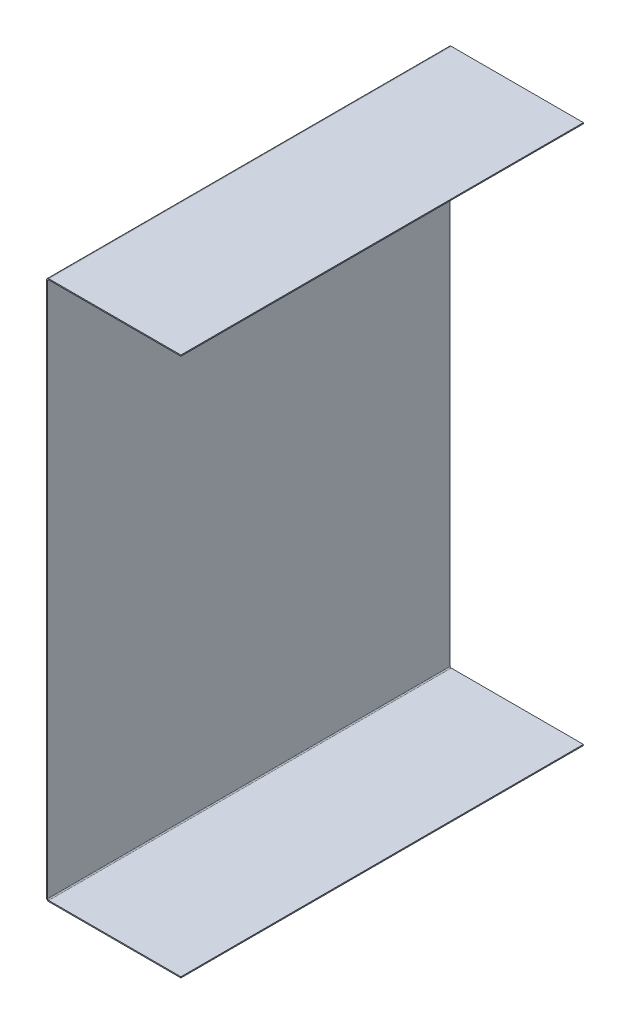
ISO-10303-21;
HEADER;
FILE_DESCRIPTION(('STEP AP214'),'2;1');
FILE_NAME('part.step','',(''),(''),'','','');
FILE_SCHEMA(('AUTOMOTIVE_DESIGN { 1 0 10303 214 1 1 1 1 }'));
ENDSEC;
DATA;
#1=APPLICATION_CONTEXT('core data for automotive mechanical design processes');
#2=APPLICATION_PROTOCOL_DEFINITION('international standard','automotive_design',2000,#1);
#3=PRODUCT_CONTEXT('',#1,'mechanical');
#4=PRODUCT('Part','Part','',(#3));
#5=PRODUCT_RELATED_PRODUCT_CATEGORY('part','',(#4));
#6=PRODUCT_DEFINITION_FORMATION('','',#4);
#7=PRODUCT_DEFINITION_CONTEXT('part definition',#1,'design');
#8=PRODUCT_DEFINITION('design','',#6,#7);
#9=PRODUCT_DEFINITION_SHAPE('','',#8);
#10=(LENGTH_UNIT() NAMED_UNIT(*) SI_UNIT(.MILLI.,.METRE.));
#11=(NAMED_UNIT(*) PLANE_ANGLE_UNIT() SI_UNIT($,.RADIAN.));
#12=(NAMED_UNIT(*) SI_UNIT($,.STERADIAN.) SOLID_ANGLE_UNIT());
#13=UNCERTAINTY_MEASURE_WITH_UNIT(LENGTH_MEASURE(1.E-05),#10,'distance_accuracy_value','');
#14=(GEOMETRIC_REPRESENTATION_CONTEXT(3) GLOBAL_UNCERTAINTY_ASSIGNED_CONTEXT((#13)) GLOBAL_UNIT_ASSIGNED_CONTEXT((#10,
#11,#12)) REPRESENTATION_CONTEXT('',''));
#15=CARTESIAN_POINT('',(0.,0.,0.));
#16=DIRECTION('',(0.,0.,1.));
#17=DIRECTION('',(1.,0.,0.));
#18=AXIS2_PLACEMENT_3D('',#15,#16,#17);
#19=CARTESIAN_POINT('',(-2.,496.,373.));
#20=DIRECTION('',(0.,0.,1.));
#21=DIRECTION('',(0.,-1.,0.));
#22=AXIS2_PLACEMENT_3D('',#19,#20,#21);
#23=PLANE('',#22);
#24=DIRECTION('',(0.,-1.,0.));
#25=VECTOR('',#24,1.);
#26=CARTESIAN_POINT('',(0.,496.,373.));
#27=LINE('',#26,#25);
#28=CARTESIAN_POINT('',(0.,496.,373.));
#29=VERTEX_POINT('',#28);
#30=CARTESIAN_POINT('',(0.,-496.,373.));
#31=VERTEX_POINT('',#30);
#32=EDGE_CURVE('E123',#29,#31,#27,.T.);
#33=ORIENTED_EDGE('',*,*,#32,.F.);
#34=DIRECTION('',(1.,0.,0.));
#35=VECTOR('',#34,1.);
#36=CARTESIAN_POINT('',(-2.,496.,373.));
#37=LINE('',#36,#35);
#38=CARTESIAN_POINT('',(-1.99999999999999,496.,373.));
#39=VERTEX_POINT('',#38);
#40=EDGE_CURVE('E92',#39,#29,#37,.T.);
#41=ORIENTED_EDGE('',*,*,#40,.F.);
#42=DIRECTION('',(0.,-1.,0.));
#43=VECTOR('',#42,1.);
#44=CARTESIAN_POINT('',(-2.,496.,373.));
#45=LINE('',#44,#43);
#46=CARTESIAN_POINT('',(-2.,-496.,373.));
#47=VERTEX_POINT('',#46);
#48=EDGE_CURVE('E130',#39,#47,#45,.T.);
#49=ORIENTED_EDGE('',*,*,#48,.T.);
#50=DIRECTION('',(1.,0.,0.));
#51=VECTOR('',#50,1.);
#52=CARTESIAN_POINT('',(-2.,-496.,373.));
#53=LINE('',#52,#51);
#54=EDGE_CURVE('E13',#47,#31,#53,.T.);
#55=ORIENTED_EDGE('',*,*,#54,.T.);
#56=EDGE_LOOP('',(#33,#41,#49,#55));
#57=FACE_BOUND('',#56,.T.);
#58=ADVANCED_FACE('F82',(#57),#23,.T.);
#59=CARTESIAN_POINT('',(-2.,496.,-373.));
#60=DIRECTION('',(0.,0.,-1.));
#61=DIRECTION('',(0.,1.,0.));
#62=AXIS2_PLACEMENT_3D('',#59,#60,#61);
#63=PLANE('',#62);
#64=DIRECTION('',(0.,1.,0.));
#65=VECTOR('',#64,1.);
#66=CARTESIAN_POINT('',(0.,496.,-373.));
#67=LINE('',#66,#65);
#68=CARTESIAN_POINT('',(0.,-496.,-373.));
#69=VERTEX_POINT('',#68);
#70=CARTESIAN_POINT('',(0.,496.,-373.));
#71=VERTEX_POINT('',#70);
#72=EDGE_CURVE('E147',#69,#71,#67,.T.);
#73=ORIENTED_EDGE('',*,*,#72,.F.);
#74=DIRECTION('',(1.,0.,0.));
#75=VECTOR('',#74,1.);
#76=CARTESIAN_POINT('',(-2.,-496.,-373.));
#77=LINE('',#76,#75);
#78=CARTESIAN_POINT('',(-1.99999999999999,-496.,-373.));
#79=VERTEX_POINT('',#78);
#80=EDGE_CURVE('E87',#79,#69,#77,.T.);
#81=ORIENTED_EDGE('',*,*,#80,.F.);
#82=DIRECTION('',(0.,1.,0.));
#83=VECTOR('',#82,1.);
#84=CARTESIAN_POINT('',(-2.,496.,-373.));
#85=LINE('',#84,#83);
#86=CARTESIAN_POINT('',(-2.,496.,-373.));
#87=VERTEX_POINT('',#86);
#88=EDGE_CURVE('E215',#79,#87,#85,.T.);
#89=ORIENTED_EDGE('',*,*,#88,.T.);
#90=DIRECTION('',(1.,0.,0.));
#91=VECTOR('',#90,1.);
#92=CARTESIAN_POINT('',(-2.,496.,-373.));
#93=LINE('',#92,#91);
#94=EDGE_CURVE('E221',#87,#71,#93,.T.);
#95=ORIENTED_EDGE('',*,*,#94,.T.);
#96=EDGE_LOOP('',(#73,#81,#89,#95));
#97=FACE_BOUND('',#96,.T.);
#98=ADVANCED_FACE('F84',(#97),#63,.T.);
#99=CARTESIAN_POINT('',(-2.,0.,0.));
#100=DIRECTION('',(1.,0.,0.));
#101=DIRECTION('',(0.,0.,-1.));
#102=AXIS2_PLACEMENT_3D('',#99,#100,#101);
#103=PLANE('',#102);
#104=DIRECTION('',(0.,0.,-1.));
#105=VECTOR('',#104,1.);
#106=CARTESIAN_POINT('',(-2.,-496.,-373.));
#107=LINE('',#106,#105);
#108=EDGE_CURVE('E105',#47,#79,#107,.T.);
#109=ORIENTED_EDGE('',*,*,#108,.F.);
#110=ORIENTED_EDGE('',*,*,#48,.F.);
#111=DIRECTION('',(0.,0.,1.));
#112=VECTOR('',#111,1.);
#113=CARTESIAN_POINT('',(-2.,496.,-373.));
#114=LINE('',#113,#112);
#115=EDGE_CURVE('E214',#87,#39,#114,.T.);
#116=ORIENTED_EDGE('',*,*,#115,.F.);
#117=ORIENTED_EDGE('',*,*,#88,.F.);
#118=EDGE_LOOP('',(#109,#110,#116,#117));
#119=FACE_BOUND('',#118,.T.);
#120=ADVANCED_FACE('F361',(#119),#103,.F.);
#121=CARTESIAN_POINT('',(0.,0.,0.));
#122=DIRECTION('',(1.,0.,0.));
#123=DIRECTION('',(0.,0.,-1.));
#124=AXIS2_PLACEMENT_3D('',#121,#122,#123);
#125=PLANE('',#124);
#126=DIRECTION('',(0.,0.,-1.));
#127=VECTOR('',#126,1.);
#128=CARTESIAN_POINT('',(0.,-496.,-373.));
#129=LINE('',#128,#127);
#130=EDGE_CURVE('E132',#31,#69,#129,.T.);
#131=ORIENTED_EDGE('',*,*,#130,.T.);
#132=ORIENTED_EDGE('',*,*,#72,.T.);
#133=DIRECTION('',(0.,0.,1.));
#134=VECTOR('',#133,1.);
#135=CARTESIAN_POINT('',(0.,496.,-373.));
#136=LINE('',#135,#134);
#137=EDGE_CURVE('E119',#71,#29,#136,.T.);
#138=ORIENTED_EDGE('',*,*,#137,.T.);
#139=ORIENTED_EDGE('',*,*,#32,.T.);
#140=EDGE_LOOP('',(#131,#132,#138,#139));
#141=FACE_BOUND('',#140,.T.);
#142=ADVANCED_FACE('F134',(#141),#125,.T.);
#143=CARTESIAN_POINT('',(2.00000000000001,496.,-373.));
#144=DIRECTION('',(0.,0.,-1.));
#145=DIRECTION('',(-1.,0.,0.));
#146=AXIS2_PLACEMENT_3D('',#143,#144,#145);
#147=PLANE('',#146);
#148=DIRECTION('',(0.,1.,0.));
#149=VECTOR('',#148,1.);
#150=CARTESIAN_POINT('',(2.,500.,-373.));
#151=LINE('',#150,#149);
#152=CARTESIAN_POINT('',(2.,498.,-373.));
#153=VERTEX_POINT('',#152);
#154=CARTESIAN_POINT('',(1.99999999999999,500.,-373.));
#155=VERTEX_POINT('',#154);
#156=EDGE_CURVE('E196',#153,#155,#151,.T.);
#157=ORIENTED_EDGE('',*,*,#156,.F.);
#158=CARTESIAN_POINT('',(2.00000000000001,496.,-373.));
#159=DIRECTION('',(0.,0.,1.));
#160=DIRECTION('',(1.,0.,0.));
#161=AXIS2_PLACEMENT_3D('',#158,#159,#160);
#162=CIRCLE('',#161,2.);
#163=EDGE_CURVE('E207',#71,#153,#162,.F.);
#164=ORIENTED_EDGE('',*,*,#163,.F.);
#165=ORIENTED_EDGE('',*,*,#94,.F.);
#166=CARTESIAN_POINT('',(2.00000000000001,496.,-373.));
#167=DIRECTION('',(0.,0.,1.));
#168=DIRECTION('',(1.,0.,0.));
#169=AXIS2_PLACEMENT_3D('',#166,#167,#168);
#170=CIRCLE('',#169,4.);
#171=EDGE_CURVE('E148',#87,#155,#170,.F.);
#172=ORIENTED_EDGE('',*,*,#171,.T.);
#173=EDGE_LOOP('',(#157,#164,#165,#172));
#174=FACE_BOUND('',#173,.T.);
#175=ADVANCED_FACE('F342',(#174),#147,.T.);
#176=CARTESIAN_POINT('',(2.00000000000001,496.,373.));
#177=DIRECTION('',(0.,0.,-1.));
#178=DIRECTION('',(-1.,0.,0.));
#179=AXIS2_PLACEMENT_3D('',#176,#177,#178);
#180=PLANE('',#179);
#181=CARTESIAN_POINT('',(2.00000000000001,496.,373.));
#182=DIRECTION('',(0.,0.,1.));
#183=DIRECTION('',(1.,0.,0.));
#184=AXIS2_PLACEMENT_3D('',#181,#182,#183);
#185=CIRCLE('',#184,2.);
#186=CARTESIAN_POINT('',(2.,498.,373.));
#187=VERTEX_POINT('',#186);
#188=EDGE_CURVE('E170',#187,#29,#185,.T.);
#189=ORIENTED_EDGE('',*,*,#188,.F.);
#190=DIRECTION('',(0.,1.,0.));
#191=VECTOR('',#190,1.);
#192=CARTESIAN_POINT('',(2.,498.,373.));
#193=LINE('',#192,#191);
#194=CARTESIAN_POINT('',(1.99999999999999,500.,373.));
#195=VERTEX_POINT('',#194);
#196=EDGE_CURVE('E195',#187,#195,#193,.T.);
#197=ORIENTED_EDGE('',*,*,#196,.T.);
#198=CARTESIAN_POINT('',(2.00000000000001,496.,373.));
#199=DIRECTION('',(0.,0.,1.));
#200=DIRECTION('',(1.,0.,0.));
#201=AXIS2_PLACEMENT_3D('',#198,#199,#200);
#202=CIRCLE('',#201,4.);
#203=EDGE_CURVE('E203',#195,#39,#202,.T.);
#204=ORIENTED_EDGE('',*,*,#203,.T.);
#205=ORIENTED_EDGE('',*,*,#40,.T.);
#206=EDGE_LOOP('',(#189,#197,#204,#205));
#207=FACE_BOUND('',#206,.T.);
#208=ADVANCED_FACE('F330',(#207),#180,.F.);
#209=CARTESIAN_POINT('',(2.00000000000001,496.,373.));
#210=DIRECTION('',(0.,0.,1.));
#211=DIRECTION('',(0.,1.,0.));
#212=AXIS2_PLACEMENT_3D('',#209,#210,#211);
#213=CYLINDRICAL_SURFACE('',#212,4.);
#214=ORIENTED_EDGE('',*,*,#115,.T.);
#215=ORIENTED_EDGE('',*,*,#203,.F.);
#216=DIRECTION('',(0.,0.,1.));
#217=VECTOR('',#216,1.);
#218=CARTESIAN_POINT('',(1.99999999999999,500.,0.));
#219=LINE('',#218,#217);
#220=EDGE_CURVE('E186',#155,#195,#219,.T.);
#221=ORIENTED_EDGE('',*,*,#220,.F.);
#222=ORIENTED_EDGE('',*,*,#171,.F.);
#223=EDGE_LOOP('',(#214,#215,#221,#222));
#224=FACE_BOUND('',#223,.T.);
#225=ADVANCED_FACE('F341',(#224),#213,.T.);
#226=CARTESIAN_POINT('',(2.00000000000001,496.,373.));
#227=DIRECTION('',(0.,0.,1.));
#228=DIRECTION('',(0.,1.,0.));
#229=AXIS2_PLACEMENT_3D('',#226,#227,#228);
#230=CYLINDRICAL_SURFACE('',#229,2.);
#231=ORIENTED_EDGE('',*,*,#137,.F.);
#232=ORIENTED_EDGE('',*,*,#163,.T.);
#233=DIRECTION('',(0.,0.,-1.));
#234=VECTOR('',#233,1.);
#235=CARTESIAN_POINT('',(2.,498.,-373.));
#236=LINE('',#235,#234);
#237=EDGE_CURVE('E194',#153,#187,#236,.F.);
#238=ORIENTED_EDGE('',*,*,#237,.T.);
#239=ORIENTED_EDGE('',*,*,#188,.T.);
#240=EDGE_LOOP('',(#231,#232,#238,#239));
#241=FACE_BOUND('',#240,.T.);
#242=ADVANCED_FACE('F325',(#241),#230,.F.);
#243=CARTESIAN_POINT('',(0.,500.,373.));
#244=DIRECTION('',(0.,0.,1.));
#245=DIRECTION('',(1.,0.,0.));
#246=AXIS2_PLACEMENT_3D('',#243,#244,#245);
#247=PLANE('',#246);
#248=DIRECTION('',(-1.,0.,0.));
#249=VECTOR('',#248,1.);
#250=CARTESIAN_POINT('',(0.,500.,373.));
#251=LINE('',#250,#249);
#252=CARTESIAN_POINT('',(247.,500.000000000001,372.999999999999));
#253=VERTEX_POINT('',#252);
#254=EDGE_CURVE('E171',#253,#195,#251,.T.);
#255=ORIENTED_EDGE('',*,*,#254,.T.);
#256=ORIENTED_EDGE('',*,*,#196,.F.);
#257=DIRECTION('',(1.,0.,0.));
#258=VECTOR('',#257,1.);
#259=CARTESIAN_POINT('',(-8.61434180847819E-13,498.,373.));
#260=LINE('',#259,#258);
#261=CARTESIAN_POINT('',(247.,498.000000000001,372.999999999999));
#262=VERTEX_POINT('',#261);
#263=EDGE_CURVE('E179',#262,#187,#260,.F.);
#264=ORIENTED_EDGE('',*,*,#263,.F.);
#265=DIRECTION('',(0.,-1.,0.));
#266=VECTOR('',#265,1.);
#267=CARTESIAN_POINT('',(247.,500.000000000001,372.999999999999));
#268=LINE('',#267,#266);
#269=EDGE_CURVE('E165',#253,#262,#268,.T.);
#270=ORIENTED_EDGE('',*,*,#269,.F.);
#271=EDGE_LOOP('',(#255,#256,#264,#270));
#272=FACE_BOUND('',#271,.T.);
#273=ADVANCED_FACE('F333',(#272),#247,.T.);
#274=CARTESIAN_POINT('',(247.,500.000000000001,-373.));
#275=DIRECTION('',(0.,0.,-1.));
#276=DIRECTION('',(-1.,0.,0.));
#277=AXIS2_PLACEMENT_3D('',#274,#275,#276);
#278=PLANE('',#277);
#279=DIRECTION('',(-1.,0.,0.));
#280=VECTOR('',#279,1.);
#281=CARTESIAN_POINT('',(-1.78354856749499E-12,498.,-373.));
#282=LINE('',#281,#280);
#283=CARTESIAN_POINT('',(247.,498.000000000001,-373.));
#284=VERTEX_POINT('',#283);
#285=EDGE_CURVE('E187',#153,#284,#282,.F.);
#286=ORIENTED_EDGE('',*,*,#285,.F.);
#287=ORIENTED_EDGE('',*,*,#156,.T.);
#288=DIRECTION('',(1.,0.,0.));
#289=VECTOR('',#288,1.);
#290=CARTESIAN_POINT('',(247.,500.000000000001,-373.));
#291=LINE('',#290,#289);
#292=CARTESIAN_POINT('',(247.,500.000000000001,-373.));
#293=VERTEX_POINT('',#292);
#294=EDGE_CURVE('E180',#155,#293,#291,.T.);
#295=ORIENTED_EDGE('',*,*,#294,.T.);
#296=DIRECTION('',(0.,-1.,0.));
#297=VECTOR('',#296,1.);
#298=CARTESIAN_POINT('',(247.,500.000000000001,-373.));
#299=LINE('',#298,#297);
#300=EDGE_CURVE('E166',#293,#284,#299,.T.);
#301=ORIENTED_EDGE('',*,*,#300,.T.);
#302=EDGE_LOOP('',(#286,#287,#295,#301));
#303=FACE_BOUND('',#302,.T.);
#304=ADVANCED_FACE('F344',(#303),#278,.T.);
#305=CARTESIAN_POINT('',(-1.79053153017267E-12,500.,0.));
#306=DIRECTION('',(0.,1.,0.));
#307=DIRECTION('',(-1.,0.,0.));
#308=AXIS2_PLACEMENT_3D('',#305,#306,#307);
#309=PLANE('',#308);
#310=ORIENTED_EDGE('',*,*,#294,.F.);
#311=ORIENTED_EDGE('',*,*,#220,.T.);
#312=ORIENTED_EDGE('',*,*,#254,.F.);
#313=DIRECTION('',(0.,0.,1.));
#314=VECTOR('',#313,1.);
#315=CARTESIAN_POINT('',(247.,500.000000000001,372.999999999999));
#316=LINE('',#315,#314);
#317=EDGE_CURVE('E172',#293,#253,#316,.T.);
#318=ORIENTED_EDGE('',*,*,#317,.F.);
#319=EDGE_LOOP('',(#310,#311,#312,#318));
#320=FACE_BOUND('',#319,.T.);
#321=ADVANCED_FACE('F336',(#320),#309,.T.);
#322=CARTESIAN_POINT('',(-1.78354856749499E-12,498.,0.));
#323=DIRECTION('',(0.,1.,0.));
#324=DIRECTION('',(-1.,0.,0.));
#325=AXIS2_PLACEMENT_3D('',#322,#323,#324);
#326=PLANE('',#325);
#327=ORIENTED_EDGE('',*,*,#237,.F.);
#328=ORIENTED_EDGE('',*,*,#285,.T.);
#329=DIRECTION('',(0.,0.,-1.));
#330=VECTOR('',#329,1.);
#331=CARTESIAN_POINT('',(247.,498.000000000001,0.));
#332=LINE('',#331,#330);
#333=EDGE_CURVE('E182',#284,#262,#332,.F.);
#334=ORIENTED_EDGE('',*,*,#333,.T.);
#335=ORIENTED_EDGE('',*,*,#263,.T.);
#336=EDGE_LOOP('',(#327,#328,#334,#335));
#337=FACE_BOUND('',#336,.T.);
#338=ADVANCED_FACE('F327',(#337),#326,.F.);
#339=CARTESIAN_POINT('',(247.,500.000000000001,372.999999999999));
#340=DIRECTION('',(1.,0.,0.));
#341=DIRECTION('',(0.,1.,0.));
#342=AXIS2_PLACEMENT_3D('',#339,#340,#341);
#343=PLANE('',#342);
#344=ORIENTED_EDGE('',*,*,#333,.F.);
#345=ORIENTED_EDGE('',*,*,#300,.F.);
#346=ORIENTED_EDGE('',*,*,#317,.T.);
#347=ORIENTED_EDGE('',*,*,#269,.T.);
#348=EDGE_LOOP('',(#344,#345,#346,#347));
#349=FACE_BOUND('',#348,.T.);
#350=ADVANCED_FACE('F349',(#349),#343,.T.);
#351=CARTESIAN_POINT('',(2.00000000000001,-496.,373.));
#352=DIRECTION('',(0.,0.,1.));
#353=DIRECTION('',(1.,0.,0.));
#354=AXIS2_PLACEMENT_3D('',#351,#352,#353);
#355=PLANE('',#354);
#356=DIRECTION('',(0.,-1.,0.));
#357=VECTOR('',#356,1.);
#358=CARTESIAN_POINT('',(1.99999999999999,-500.,373.));
#359=LINE('',#358,#357);
#360=CARTESIAN_POINT('',(2.,-498.,373.));
#361=VERTEX_POINT('',#360);
#362=CARTESIAN_POINT('',(1.99999999999999,-500.,373.));
#363=VERTEX_POINT('',#362);
#364=EDGE_CURVE('E153',#361,#363,#359,.T.);
#365=ORIENTED_EDGE('',*,*,#364,.F.);
#366=CARTESIAN_POINT('',(2.00000000000001,-496.,373.));
#367=DIRECTION('',(0.,0.,-1.));
#368=DIRECTION('',(-1.,0.,0.));
#369=AXIS2_PLACEMENT_3D('',#366,#367,#368);
#370=CIRCLE('',#369,2.);
#371=EDGE_CURVE('E144',#31,#361,#370,.F.);
#372=ORIENTED_EDGE('',*,*,#371,.F.);
#373=ORIENTED_EDGE('',*,*,#54,.F.);
#374=CARTESIAN_POINT('',(2.00000000000001,-496.,373.));
#375=DIRECTION('',(0.,0.,-1.));
#376=DIRECTION('',(-1.,0.,0.));
#377=AXIS2_PLACEMENT_3D('',#374,#375,#376);
#378=CIRCLE('',#377,4.);
#379=EDGE_CURVE('E157',#47,#363,#378,.F.);
#380=ORIENTED_EDGE('',*,*,#379,.T.);
#381=EDGE_LOOP('',(#365,#372,#373,#380));
#382=FACE_BOUND('',#381,.T.);
#383=ADVANCED_FACE('F152',(#382),#355,.T.);
#384=CARTESIAN_POINT('',(2.00000000000001,-496.,-373.));
#385=DIRECTION('',(0.,0.,1.));
#386=DIRECTION('',(1.,0.,0.));
#387=AXIS2_PLACEMENT_3D('',#384,#385,#386);
#388=PLANE('',#387);
#389=CARTESIAN_POINT('',(2.00000000000001,-496.,-373.));
#390=DIRECTION('',(0.,0.,-1.));
#391=DIRECTION('',(-1.,0.,0.));
#392=AXIS2_PLACEMENT_3D('',#389,#390,#391);
#393=CIRCLE('',#392,2.);
#394=CARTESIAN_POINT('',(2.,-498.,-373.));
#395=VERTEX_POINT('',#394);
#396=EDGE_CURVE('E150',#395,#69,#393,.T.);
#397=ORIENTED_EDGE('',*,*,#396,.F.);
#398=DIRECTION('',(0.,-1.,0.));
#399=VECTOR('',#398,1.);
#400=CARTESIAN_POINT('',(2.,-498.,-373.));
#401=LINE('',#400,#399);
#402=CARTESIAN_POINT('',(2.,-500.,-373.));
#403=VERTEX_POINT('',#402);
#404=EDGE_CURVE('E244',#395,#403,#401,.T.);
#405=ORIENTED_EDGE('',*,*,#404,.T.);
#406=CARTESIAN_POINT('',(2.00000000000001,-496.,-373.));
#407=DIRECTION('',(0.,0.,-1.));
#408=DIRECTION('',(-1.,0.,0.));
#409=AXIS2_PLACEMENT_3D('',#406,#407,#408);
#410=CIRCLE('',#409,4.);
#411=EDGE_CURVE('E155',#403,#79,#410,.T.);
#412=ORIENTED_EDGE('',*,*,#411,.T.);
#413=ORIENTED_EDGE('',*,*,#80,.T.);
#414=EDGE_LOOP('',(#397,#405,#412,#413));
#415=FACE_BOUND('',#414,.T.);
#416=ADVANCED_FACE('F228',(#415),#388,.F.);
#417=CARTESIAN_POINT('',(2.00000000000001,-496.,-373.));
#418=DIRECTION('',(0.,0.,-1.));
#419=DIRECTION('',(0.,-1.,0.));
#420=AXIS2_PLACEMENT_3D('',#417,#418,#419);
#421=CYLINDRICAL_SURFACE('',#420,4.);
#422=ORIENTED_EDGE('',*,*,#108,.T.);
#423=ORIENTED_EDGE('',*,*,#411,.F.);
#424=DIRECTION('',(0.,0.,-1.));
#425=VECTOR('',#424,1.);
#426=CARTESIAN_POINT('',(1.99999999999999,-500.,373.));
#427=LINE('',#426,#425);
#428=EDGE_CURVE('E239',#403,#363,#427,.F.);
#429=ORIENTED_EDGE('',*,*,#428,.T.);
#430=ORIENTED_EDGE('',*,*,#379,.F.);
#431=EDGE_LOOP('',(#422,#423,#429,#430));
#432=FACE_BOUND('',#431,.T.);
#433=ADVANCED_FACE('F236',(#432),#421,.T.);
#434=CARTESIAN_POINT('',(2.00000000000001,-496.,-373.));
#435=DIRECTION('',(0.,0.,-1.));
#436=DIRECTION('',(0.,-1.,0.));
#437=AXIS2_PLACEMENT_3D('',#434,#435,#436);
#438=CYLINDRICAL_SURFACE('',#437,2.);
#439=ORIENTED_EDGE('',*,*,#130,.F.);
#440=ORIENTED_EDGE('',*,*,#371,.T.);
#441=DIRECTION('',(0.,0.,-1.));
#442=VECTOR('',#441,1.);
#443=CARTESIAN_POINT('',(2.,-498.,373.));
#444=LINE('',#443,#442);
#445=EDGE_CURVE('E243',#361,#395,#444,.T.);
#446=ORIENTED_EDGE('',*,*,#445,.T.);
#447=ORIENTED_EDGE('',*,*,#396,.T.);
#448=EDGE_LOOP('',(#439,#440,#446,#447));
#449=FACE_BOUND('',#448,.T.);
#450=ADVANCED_FACE('F142',(#449),#438,.F.);
#451=CARTESIAN_POINT('',(0.,-500.,373.));
#452=DIRECTION('',(0.,0.,1.));
#453=DIRECTION('',(1.,0.,0.));
#454=AXIS2_PLACEMENT_3D('',#451,#452,#453);
#455=PLANE('',#454);
#456=DIRECTION('',(1.,0.,0.));
#457=VECTOR('',#456,1.);
#458=CARTESIAN_POINT('',(-2.53800579293358E-12,-498.,373.));
#459=LINE('',#458,#457);
#460=CARTESIAN_POINT('',(247.,-498.000000000001,373.));
#461=VERTEX_POINT('',#460);
#462=EDGE_CURVE('E247',#361,#461,#459,.T.);
#463=ORIENTED_EDGE('',*,*,#462,.F.);
#464=ORIENTED_EDGE('',*,*,#364,.T.);
#465=DIRECTION('',(-1.,0.,0.));
#466=VECTOR('',#465,1.);
#467=CARTESIAN_POINT('',(0.,-500.,373.));
#468=LINE('',#467,#466);
#469=CARTESIAN_POINT('',(247.,-500.000000000001,373.));
#470=VERTEX_POINT('',#469);
#471=EDGE_CURVE('E260',#363,#470,#468,.F.);
#472=ORIENTED_EDGE('',*,*,#471,.T.);
#473=DIRECTION('',(0.,1.,0.));
#474=VECTOR('',#473,1.);
#475=CARTESIAN_POINT('',(247.,-500.000000000001,373.));
#476=LINE('',#475,#474);
#477=EDGE_CURVE('E267',#470,#461,#476,.T.);
#478=ORIENTED_EDGE('',*,*,#477,.T.);
#479=EDGE_LOOP('',(#463,#464,#472,#478));
#480=FACE_BOUND('',#479,.T.);
#481=ADVANCED_FACE('F289',(#480),#455,.T.);
#482=CARTESIAN_POINT('',(247.,-500.000000000001,-373.));
#483=DIRECTION('',(0.,0.,-1.));
#484=DIRECTION('',(-1.,0.,0.));
#485=AXIS2_PLACEMENT_3D('',#482,#483,#484);
#486=PLANE('',#485);
#487=DIRECTION('',(1.,0.,0.));
#488=VECTOR('',#487,1.);
#489=CARTESIAN_POINT('',(247.,-500.000000000001,-373.));
#490=LINE('',#489,#488);
#491=CARTESIAN_POINT('',(247.,-500.000000000001,-373.));
#492=VERTEX_POINT('',#491);
#493=EDGE_CURVE('E261',#492,#403,#490,.F.);
#494=ORIENTED_EDGE('',*,*,#493,.T.);
#495=ORIENTED_EDGE('',*,*,#404,.F.);
#496=DIRECTION('',(-1.,0.,0.));
#497=VECTOR('',#496,1.);
#498=CARTESIAN_POINT('',(-2.03503430930785E-12,-498.,-373.));
#499=LINE('',#498,#497);
#500=CARTESIAN_POINT('',(247.,-498.000000000001,-373.));
#501=VERTEX_POINT('',#500);
#502=EDGE_CURVE('E251',#501,#395,#499,.T.);
#503=ORIENTED_EDGE('',*,*,#502,.F.);
#504=DIRECTION('',(0.,1.,0.));
#505=VECTOR('',#504,1.);
#506=CARTESIAN_POINT('',(247.,-500.000000000001,-373.));
#507=LINE('',#506,#505);
#508=EDGE_CURVE('E159',#492,#501,#507,.T.);
#509=ORIENTED_EDGE('',*,*,#508,.F.);
#510=EDGE_LOOP('',(#494,#495,#503,#509));
#511=FACE_BOUND('',#510,.T.);
#512=ADVANCED_FACE('F283',(#511),#486,.T.);
#513=CARTESIAN_POINT('',(-1.79053153017267E-12,-500.,0.));
#514=DIRECTION('',(0.,1.,0.));
#515=DIRECTION('',(-1.,0.,0.));
#516=AXIS2_PLACEMENT_3D('',#513,#514,#515);
#517=PLANE('',#516);
#518=ORIENTED_EDGE('',*,*,#428,.F.);
#519=ORIENTED_EDGE('',*,*,#493,.F.);
#520=DIRECTION('',(0.,0.,1.));
#521=VECTOR('',#520,1.);
#522=CARTESIAN_POINT('',(247.,-500.000000000001,373.));
#523=LINE('',#522,#521);
#524=EDGE_CURVE('E259',#470,#492,#523,.F.);
#525=ORIENTED_EDGE('',*,*,#524,.F.);
#526=ORIENTED_EDGE('',*,*,#471,.F.);
#527=EDGE_LOOP('',(#518,#519,#525,#526));
#528=FACE_BOUND('',#527,.T.);
#529=ADVANCED_FACE('F295',(#528),#517,.F.);
#530=CARTESIAN_POINT('',(-1.78354856749499E-12,-498.,0.));
#531=DIRECTION('',(0.,1.,0.));
#532=DIRECTION('',(-1.,0.,0.));
#533=AXIS2_PLACEMENT_3D('',#530,#531,#532);
#534=PLANE('',#533);
#535=ORIENTED_EDGE('',*,*,#502,.T.);
#536=ORIENTED_EDGE('',*,*,#445,.F.);
#537=ORIENTED_EDGE('',*,*,#462,.T.);
#538=DIRECTION('',(0.,0.,-1.));
#539=VECTOR('',#538,1.);
#540=CARTESIAN_POINT('',(247.,-498.000000000001,0.));
#541=LINE('',#540,#539);
#542=EDGE_CURVE('E252',#461,#501,#541,.T.);
#543=ORIENTED_EDGE('',*,*,#542,.T.);
#544=EDGE_LOOP('',(#535,#536,#537,#543));
#545=FACE_BOUND('',#544,.T.);
#546=ADVANCED_FACE('F286',(#545),#534,.T.);
#547=CARTESIAN_POINT('',(247.,-500.000000000001,373.));
#548=DIRECTION('',(1.,0.,0.));
#549=DIRECTION('',(0.,1.,0.));
#550=AXIS2_PLACEMENT_3D('',#547,#548,#549);
#551=PLANE('',#550);
#552=ORIENTED_EDGE('',*,*,#542,.F.);
#553=ORIENTED_EDGE('',*,*,#477,.F.);
#554=ORIENTED_EDGE('',*,*,#524,.T.);
#555=ORIENTED_EDGE('',*,*,#508,.T.);
#556=EDGE_LOOP('',(#552,#553,#554,#555));
#557=FACE_BOUND('',#556,.T.);
#558=ADVANCED_FACE('F273',(#557),#551,.T.);
#559=CLOSED_SHELL('',(#58,#98,#120,#142,#175,#208,#225,#242,#273,#304,#321,#338,#350,#383,#416,
#433,#450,#481,#512,#529,#546,#558));
#560=MANIFOLD_SOLID_BREP('B2',#559);
#561=ADVANCED_BREP_SHAPE_REPRESENTATION('',(#18,#560),#14);
#562=SHAPE_DEFINITION_REPRESENTATION(#9,#561);
ENDSEC;
END-ISO-10303-21;
